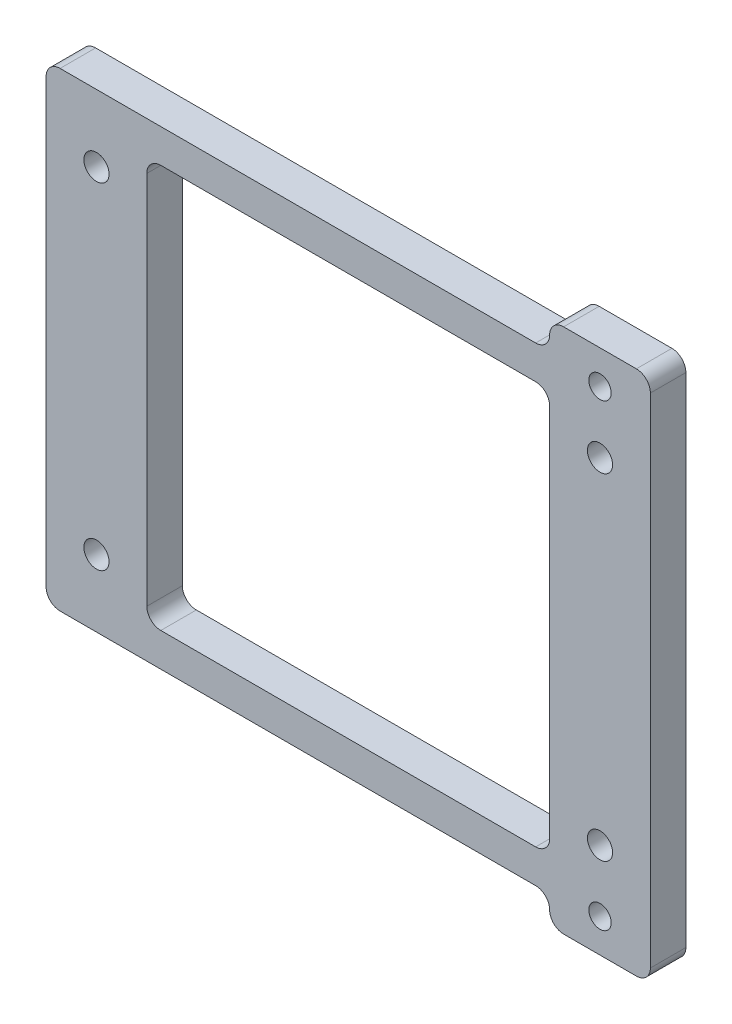
ISO-10303-21;
HEADER;
FILE_DESCRIPTION(('STEP AP214'),'2;1');
FILE_NAME('part.step','',(''),(''),'','','');
FILE_SCHEMA(('AUTOMOTIVE_DESIGN { 1 0 10303 214 1 1 1 1 }'));
ENDSEC;
DATA;
#1=APPLICATION_CONTEXT('core data for automotive mechanical design processes');
#2=APPLICATION_PROTOCOL_DEFINITION('international standard','automotive_design',2000,#1);
#3=PRODUCT_CONTEXT('',#1,'mechanical');
#4=PRODUCT('Part','Part','',(#3));
#5=PRODUCT_RELATED_PRODUCT_CATEGORY('part','',(#4));
#6=PRODUCT_DEFINITION_FORMATION('','',#4);
#7=PRODUCT_DEFINITION_CONTEXT('part definition',#1,'design');
#8=PRODUCT_DEFINITION('design','',#6,#7);
#9=PRODUCT_DEFINITION_SHAPE('','',#8);
#10=(LENGTH_UNIT() NAMED_UNIT(*) SI_UNIT(.MILLI.,.METRE.));
#11=(NAMED_UNIT(*) PLANE_ANGLE_UNIT() SI_UNIT($,.RADIAN.));
#12=(NAMED_UNIT(*) SI_UNIT($,.STERADIAN.) SOLID_ANGLE_UNIT());
#13=UNCERTAINTY_MEASURE_WITH_UNIT(LENGTH_MEASURE(1.E-05),#10,'distance_accuracy_value','');
#14=(GEOMETRIC_REPRESENTATION_CONTEXT(3) GLOBAL_UNCERTAINTY_ASSIGNED_CONTEXT((#13)) GLOBAL_UNIT_ASSIGNED_CONTEXT((#10,
#11,#12)) REPRESENTATION_CONTEXT('',''));
#15=CARTESIAN_POINT('',(0.,0.,0.));
#16=DIRECTION('',(0.,0.,1.));
#17=DIRECTION('',(1.,0.,0.));
#18=AXIS2_PLACEMENT_3D('',#15,#16,#17);
#19=CARTESIAN_POINT('',(0.,0.,6.35));
#20=DIRECTION('',(0.,0.,1.));
#21=DIRECTION('',(1.,0.,0.));
#22=AXIS2_PLACEMENT_3D('',#19,#20,#21);
#23=PLANE('',#22);
#24=CARTESIAN_POINT('',(45.1075947427526,-41.,6.35));
#25=DIRECTION('',(0.,0.,1.));
#26=DIRECTION('',(1.,0.,0.));
#27=AXIS2_PLACEMENT_3D('',#24,#25,#26);
#28=CIRCLE('',#27,2.);
#29=CARTESIAN_POINT('',(47.1075947427526,-41.,6.35));
#30=VERTEX_POINT('',#29);
#31=EDGE_CURVE('E477',#30,#30,#28,.T.);
#32=ORIENTED_EDGE('',*,*,#31,.F.);
#33=EDGE_LOOP('',(#32));
#34=FACE_BOUND('',#33,.T.);
#35=CARTESIAN_POINT('',(45.1075947427528,-30.,6.35));
#36=DIRECTION('',(0.,0.,1.));
#37=DIRECTION('',(1.,0.,0.));
#38=AXIS2_PLACEMENT_3D('',#35,#36,#37);
#39=CIRCLE('',#38,2.25);
#40=CARTESIAN_POINT('',(47.3575947427528,-30.,6.35));
#41=VERTEX_POINT('',#40);
#42=EDGE_CURVE('E505',#41,#41,#39,.T.);
#43=ORIENTED_EDGE('',*,*,#42,.F.);
#44=EDGE_LOOP('',(#43));
#45=FACE_BOUND('',#44,.T.);
#46=CARTESIAN_POINT('',(-44.8924052572479,30.,6.35));
#47=DIRECTION('',(0.,0.,1.));
#48=DIRECTION('',(1.,0.,0.));
#49=AXIS2_PLACEMENT_3D('',#46,#47,#48);
#50=CIRCLE('',#49,2.25);
#51=CARTESIAN_POINT('',(-42.6424052572479,30.,6.35));
#52=VERTEX_POINT('',#51);
#53=EDGE_CURVE('E346',#52,#52,#50,.T.);
#54=ORIENTED_EDGE('',*,*,#53,.F.);
#55=EDGE_LOOP('',(#54));
#56=FACE_BOUND('',#55,.T.);
#57=DIRECTION('',(-1.,0.,0.));
#58=VECTOR('',#57,1.);
#59=CARTESIAN_POINT('',(54.1075947427521,46.9999999999989,6.35));
#60=LINE('',#59,#58);
#61=CARTESIAN_POINT('',(51.6075947427521,46.9999999999989,6.35));
#62=VERTEX_POINT('',#61);
#63=CARTESIAN_POINT('',(38.6075947427521,46.9999999999989,6.35));
#64=VERTEX_POINT('',#63);
#65=EDGE_CURVE('E222',#62,#64,#60,.T.);
#66=ORIENTED_EDGE('',*,*,#65,.T.);
#67=CARTESIAN_POINT('',(38.6075947427521,44.4999999999989,6.35));
#68=DIRECTION('',(0.,0.,1.));
#69=DIRECTION('',(1.,0.,0.));
#70=AXIS2_PLACEMENT_3D('',#67,#68,#69);
#71=CIRCLE('',#70,2.5);
#72=CARTESIAN_POINT('',(36.1075947427521,44.4999999999989,6.35));
#73=VERTEX_POINT('',#72);
#74=EDGE_CURVE('E54',#64,#73,#71,.T.);
#75=ORIENTED_EDGE('',*,*,#74,.T.);
#76=CARTESIAN_POINT('',(33.6075947427521,44.5,6.35));
#77=DIRECTION('',(0.,0.,1.));
#78=DIRECTION('',(1.,0.,0.));
#79=AXIS2_PLACEMENT_3D('',#76,#77,#78);
#80=CIRCLE('',#79,2.5);
#81=CARTESIAN_POINT('',(33.6075947427521,42.,6.35));
#82=VERTEX_POINT('',#81);
#83=EDGE_CURVE('E307',#73,#82,#80,.F.);
#84=ORIENTED_EDGE('',*,*,#83,.T.);
#85=DIRECTION('',(-1.,0.,0.));
#86=VECTOR('',#85,1.);
#87=CARTESIAN_POINT('',(36.1075947427521,42.,6.35));
#88=LINE('',#87,#86);
#89=CARTESIAN_POINT('',(-51.3924052572478,42.,6.35));
#90=VERTEX_POINT('',#89);
#91=EDGE_CURVE('E217',#82,#90,#88,.T.);
#92=ORIENTED_EDGE('',*,*,#91,.T.);
#93=CARTESIAN_POINT('',(-51.3924052572478,39.5,6.35));
#94=DIRECTION('',(0.,0.,1.));
#95=DIRECTION('',(1.,0.,0.));
#96=AXIS2_PLACEMENT_3D('',#93,#94,#95);
#97=CIRCLE('',#96,2.5);
#98=CARTESIAN_POINT('',(-53.8924052572478,39.5,6.35));
#99=VERTEX_POINT('',#98);
#100=EDGE_CURVE('E263',#90,#99,#97,.T.);
#101=ORIENTED_EDGE('',*,*,#100,.T.);
#102=DIRECTION('',(0.,-1.,0.));
#103=VECTOR('',#102,1.);
#104=CARTESIAN_POINT('',(-53.8924052572478,-42.,6.35));
#105=LINE('',#104,#103);
#106=CARTESIAN_POINT('',(-53.8924052572478,-39.5,6.35));
#107=VERTEX_POINT('',#106);
#108=EDGE_CURVE('E355',#99,#107,#105,.T.);
#109=ORIENTED_EDGE('',*,*,#108,.T.);
#110=CARTESIAN_POINT('',(-51.3924052572479,-39.5,6.35));
#111=DIRECTION('',(0.,0.,1.));
#112=DIRECTION('',(1.,0.,0.));
#113=AXIS2_PLACEMENT_3D('',#110,#111,#112);
#114=CIRCLE('',#113,2.5);
#115=CARTESIAN_POINT('',(-51.3924052572478,-42.,6.35));
#116=VERTEX_POINT('',#115);
#117=EDGE_CURVE('E265',#107,#116,#114,.T.);
#118=ORIENTED_EDGE('',*,*,#117,.T.);
#119=DIRECTION('',(1.,0.,0.));
#120=VECTOR('',#119,1.);
#121=CARTESIAN_POINT('',(36.1075947427521,-42.,6.35));
#122=LINE('',#121,#120);
#123=CARTESIAN_POINT('',(33.6075947427521,-42.,6.35));
#124=VERTEX_POINT('',#123);
#125=EDGE_CURVE('E359',#116,#124,#122,.T.);
#126=ORIENTED_EDGE('',*,*,#125,.T.);
#127=CARTESIAN_POINT('',(33.6075947427521,-44.5,6.35));
#128=DIRECTION('',(0.,0.,1.));
#129=DIRECTION('',(1.,0.,0.));
#130=AXIS2_PLACEMENT_3D('',#127,#128,#129);
#131=CIRCLE('',#130,2.5);
#132=CARTESIAN_POINT('',(36.1075947427521,-44.4999999999995,6.35));
#133=VERTEX_POINT('',#132);
#134=EDGE_CURVE('E11',#124,#133,#131,.F.);
#135=ORIENTED_EDGE('',*,*,#134,.T.);
#136=CARTESIAN_POINT('',(38.6075947427521,-44.4999999999995,6.35));
#137=DIRECTION('',(0.,0.,1.));
#138=DIRECTION('',(1.,0.,0.));
#139=AXIS2_PLACEMENT_3D('',#136,#137,#138);
#140=CIRCLE('',#139,2.5);
#141=CARTESIAN_POINT('',(38.6075947427521,-46.9999999999995,6.35));
#142=VERTEX_POINT('',#141);
#143=EDGE_CURVE('E267',#133,#142,#140,.T.);
#144=ORIENTED_EDGE('',*,*,#143,.T.);
#145=DIRECTION('',(1.,0.,0.));
#146=VECTOR('',#145,1.);
#147=CARTESIAN_POINT('',(54.1075947427521,-46.9999999999995,6.35));
#148=LINE('',#147,#146);
#149=CARTESIAN_POINT('',(51.6075947427524,-46.9999999999995,6.35));
#150=VERTEX_POINT('',#149);
#151=EDGE_CURVE('E363',#142,#150,#148,.T.);
#152=ORIENTED_EDGE('',*,*,#151,.T.);
#153=CARTESIAN_POINT('',(51.6075947427524,-44.4999999999995,6.35));
#154=DIRECTION('',(0.,0.,1.));
#155=DIRECTION('',(1.,0.,0.));
#156=AXIS2_PLACEMENT_3D('',#153,#154,#155);
#157=CIRCLE('',#156,2.5);
#158=CARTESIAN_POINT('',(54.1075947427521,-44.4999999999995,6.35));
#159=VERTEX_POINT('',#158);
#160=EDGE_CURVE('E269',#150,#159,#157,.T.);
#161=ORIENTED_EDGE('',*,*,#160,.T.);
#162=DIRECTION('',(0.,1.,0.));
#163=VECTOR('',#162,1.);
#164=CARTESIAN_POINT('',(54.1075947427522,-42.,6.35));
#165=LINE('',#164,#163);
#166=CARTESIAN_POINT('',(54.1075947427524,44.4999999999989,6.35));
#167=VERTEX_POINT('',#166);
#168=EDGE_CURVE('E371',#159,#167,#165,.T.);
#169=ORIENTED_EDGE('',*,*,#168,.T.);
#170=CARTESIAN_POINT('',(51.6075947427521,44.4999999999989,6.35));
#171=DIRECTION('',(0.,0.,1.));
#172=DIRECTION('',(1.,0.,0.));
#173=AXIS2_PLACEMENT_3D('',#170,#171,#172);
#174=CIRCLE('',#173,2.5);
#175=EDGE_CURVE('E271',#167,#62,#174,.T.);
#176=ORIENTED_EDGE('',*,*,#175,.T.);
#177=EDGE_LOOP('',(#66,#75,#84,#92,#101,#109,#118,#126,#135,#144,#152,#161,#169,#176));
#178=FACE_BOUND('',#177,.T.);
#179=CARTESIAN_POINT('',(45.1075947427521,30.,6.35));
#180=DIRECTION('',(0.,0.,1.));
#181=DIRECTION('',(1.,0.,0.));
#182=AXIS2_PLACEMENT_3D('',#179,#180,#181);
#183=CIRCLE('',#182,2.25);
#184=CARTESIAN_POINT('',(47.3575947427521,30.,6.35));
#185=VERTEX_POINT('',#184);
#186=EDGE_CURVE('E511',#185,#185,#183,.T.);
#187=ORIENTED_EDGE('',*,*,#186,.F.);
#188=EDGE_LOOP('',(#187));
#189=FACE_BOUND('',#188,.T.);
#190=CARTESIAN_POINT('',(-44.8924052572472,-30.,6.35));
#191=DIRECTION('',(0.,0.,1.));
#192=DIRECTION('',(1.,0.,0.));
#193=AXIS2_PLACEMENT_3D('',#190,#191,#192);
#194=CIRCLE('',#193,2.25);
#195=CARTESIAN_POINT('',(-42.6424052572472,-30.,6.35));
#196=VERTEX_POINT('',#195);
#197=EDGE_CURVE('E499',#196,#196,#194,.T.);
#198=ORIENTED_EDGE('',*,*,#197,.F.);
#199=EDGE_LOOP('',(#198));
#200=FACE_BOUND('',#199,.T.);
#201=DIRECTION('',(1.,0.,0.));
#202=VECTOR('',#201,1.);
#203=CARTESIAN_POINT('',(36.1075947427521,-36.,6.35));
#204=LINE('',#203,#202);
#205=CARTESIAN_POINT('',(-33.3924052572478,-36.,6.35));
#206=VERTEX_POINT('',#205);
#207=CARTESIAN_POINT('',(33.6075947427521,-36.,6.35));
#208=VERTEX_POINT('',#207);
#209=EDGE_CURVE('E485',#206,#208,#204,.T.);
#210=ORIENTED_EDGE('',*,*,#209,.F.);
#211=CARTESIAN_POINT('',(-33.3924052572478,-33.5,6.35));
#212=DIRECTION('',(0.,0.,1.));
#213=DIRECTION('',(1.,0.,0.));
#214=AXIS2_PLACEMENT_3D('',#211,#212,#213);
#215=CIRCLE('',#214,2.5);
#216=CARTESIAN_POINT('',(-35.8924052572479,-33.5,6.35));
#217=VERTEX_POINT('',#216);
#218=EDGE_CURVE('E202',#206,#217,#215,.F.);
#219=ORIENTED_EDGE('',*,*,#218,.T.);
#220=DIRECTION('',(0.,-1.,0.));
#221=VECTOR('',#220,1.);
#222=CARTESIAN_POINT('',(-35.8924052572479,-36.,6.35));
#223=LINE('',#222,#221);
#224=CARTESIAN_POINT('',(-35.8924052572479,33.5,6.35));
#225=VERTEX_POINT('',#224);
#226=EDGE_CURVE('E482',#225,#217,#223,.T.);
#227=ORIENTED_EDGE('',*,*,#226,.F.);
#228=CARTESIAN_POINT('',(-33.3924052572478,33.5,6.35));
#229=DIRECTION('',(0.,0.,1.));
#230=DIRECTION('',(1.,0.,0.));
#231=AXIS2_PLACEMENT_3D('',#228,#229,#230);
#232=CIRCLE('',#231,2.5);
#233=CARTESIAN_POINT('',(-33.3924052572478,36.,6.35));
#234=VERTEX_POINT('',#233);
#235=EDGE_CURVE('E299',#225,#234,#232,.F.);
#236=ORIENTED_EDGE('',*,*,#235,.T.);
#237=DIRECTION('',(-1.,0.,0.));
#238=VECTOR('',#237,1.);
#239=CARTESIAN_POINT('',(36.1075947427521,36.,6.35));
#240=LINE('',#239,#238);
#241=CARTESIAN_POINT('',(33.6075947427521,36.,6.35));
#242=VERTEX_POINT('',#241);
#243=EDGE_CURVE('E491',#242,#234,#240,.T.);
#244=ORIENTED_EDGE('',*,*,#243,.F.);
#245=CARTESIAN_POINT('',(33.6075947427521,33.5,6.35));
#246=DIRECTION('',(0.,0.,1.));
#247=DIRECTION('',(1.,0.,0.));
#248=AXIS2_PLACEMENT_3D('',#245,#246,#247);
#249=CIRCLE('',#248,2.5);
#250=CARTESIAN_POINT('',(36.1075947427521,33.5,6.35));
#251=VERTEX_POINT('',#250);
#252=EDGE_CURVE('E303',#242,#251,#249,.F.);
#253=ORIENTED_EDGE('',*,*,#252,.T.);
#254=DIRECTION('',(0.,1.,0.));
#255=VECTOR('',#254,1.);
#256=CARTESIAN_POINT('',(36.1075947427521,-36.,6.35));
#257=LINE('',#256,#255);
#258=CARTESIAN_POINT('',(36.1075947427521,-33.5,6.35));
#259=VERTEX_POINT('',#258);
#260=EDGE_CURVE('E488',#259,#251,#257,.T.);
#261=ORIENTED_EDGE('',*,*,#260,.F.);
#262=CARTESIAN_POINT('',(33.6075947427521,-33.5,6.35));
#263=DIRECTION('',(0.,0.,1.));
#264=DIRECTION('',(1.,0.,0.));
#265=AXIS2_PLACEMENT_3D('',#262,#263,#264);
#266=CIRCLE('',#265,2.5);
#267=EDGE_CURVE('E203',#259,#208,#266,.F.);
#268=ORIENTED_EDGE('',*,*,#267,.T.);
#269=EDGE_LOOP('',(#210,#219,#227,#236,#244,#253,#261,#268));
#270=FACE_BOUND('',#269,.T.);
#271=CARTESIAN_POINT('',(45.1075947427526,41.,6.35));
#272=DIRECTION('',(0.,0.,1.));
#273=DIRECTION('',(-1.,0.,0.));
#274=AXIS2_PLACEMENT_3D('',#271,#272,#273);
#275=CIRCLE('',#274,2.);
#276=CARTESIAN_POINT('',(43.1075947427526,41.,6.35));
#277=VERTEX_POINT('',#276);
#278=EDGE_CURVE('E315',#277,#277,#275,.T.);
#279=ORIENTED_EDGE('',*,*,#278,.F.);
#280=EDGE_LOOP('',(#279));
#281=FACE_BOUND('',#280,.T.);
#282=ADVANCED_FACE('F37',(#34,#45,#56,#178,#189,#200,#270,#281),#23,.T.);
#283=CARTESIAN_POINT('',(0.,0.,0.));
#284=DIRECTION('',(0.,0.,1.));
#285=DIRECTION('',(1.,0.,0.));
#286=AXIS2_PLACEMENT_3D('',#283,#284,#285);
#287=PLANE('',#286);
#288=CARTESIAN_POINT('',(-44.8924052572472,-30.,0.));
#289=DIRECTION('',(0.,0.,1.));
#290=DIRECTION('',(1.,0.,0.));
#291=AXIS2_PLACEMENT_3D('',#288,#289,#290);
#292=CIRCLE('',#291,2.25);
#293=CARTESIAN_POINT('',(-42.6424052572472,-30.,0.));
#294=VERTEX_POINT('',#293);
#295=EDGE_CURVE('E494',#294,#294,#292,.T.);
#296=ORIENTED_EDGE('',*,*,#295,.T.);
#297=EDGE_LOOP('',(#296));
#298=FACE_BOUND('',#297,.T.);
#299=CARTESIAN_POINT('',(45.1075947427528,-30.,0.));
#300=DIRECTION('',(0.,0.,1.));
#301=DIRECTION('',(1.,0.,0.));
#302=AXIS2_PLACEMENT_3D('',#299,#300,#301);
#303=CIRCLE('',#302,2.25);
#304=CARTESIAN_POINT('',(47.3575947427528,-30.,0.));
#305=VERTEX_POINT('',#304);
#306=EDGE_CURVE('E502',#305,#305,#303,.T.);
#307=ORIENTED_EDGE('',*,*,#306,.T.);
#308=EDGE_LOOP('',(#307));
#309=FACE_BOUND('',#308,.T.);
#310=CARTESIAN_POINT('',(45.1075947427521,30.,0.));
#311=DIRECTION('',(0.,0.,1.));
#312=DIRECTION('',(1.,0.,0.));
#313=AXIS2_PLACEMENT_3D('',#310,#311,#312);
#314=CIRCLE('',#313,2.25);
#315=CARTESIAN_POINT('',(47.3575947427521,30.,0.));
#316=VERTEX_POINT('',#315);
#317=EDGE_CURVE('E508',#316,#316,#314,.T.);
#318=ORIENTED_EDGE('',*,*,#317,.T.);
#319=EDGE_LOOP('',(#318));
#320=FACE_BOUND('',#319,.T.);
#321=CARTESIAN_POINT('',(-44.8924052572479,30.,0.));
#322=DIRECTION('',(0.,0.,1.));
#323=DIRECTION('',(1.,0.,0.));
#324=AXIS2_PLACEMENT_3D('',#321,#322,#323);
#325=CIRCLE('',#324,2.25);
#326=CARTESIAN_POINT('',(-42.6424052572479,30.,0.));
#327=VERTEX_POINT('',#326);
#328=EDGE_CURVE('E366',#327,#327,#325,.T.);
#329=ORIENTED_EDGE('',*,*,#328,.T.);
#330=EDGE_LOOP('',(#329));
#331=FACE_BOUND('',#330,.T.);
#332=DIRECTION('',(-1.,0.,0.));
#333=VECTOR('',#332,1.);
#334=CARTESIAN_POINT('',(36.1075947427521,42.,0.));
#335=LINE('',#334,#333);
#336=CARTESIAN_POINT('',(33.6075947427521,42.,0.));
#337=VERTEX_POINT('',#336);
#338=CARTESIAN_POINT('',(-51.3924052572478,42.,0.));
#339=VERTEX_POINT('',#338);
#340=EDGE_CURVE('E225',#337,#339,#335,.T.);
#341=ORIENTED_EDGE('',*,*,#340,.F.);
#342=CARTESIAN_POINT('',(33.6075947427521,44.5,0.));
#343=DIRECTION('',(0.,0.,1.));
#344=DIRECTION('',(1.,0.,0.));
#345=AXIS2_PLACEMENT_3D('',#342,#343,#344);
#346=CIRCLE('',#345,2.5);
#347=CARTESIAN_POINT('',(36.1075947427521,44.4999999999989,0.));
#348=VERTEX_POINT('',#347);
#349=EDGE_CURVE('E305',#337,#348,#346,.T.);
#350=ORIENTED_EDGE('',*,*,#349,.T.);
#351=CARTESIAN_POINT('',(38.6075947427521,44.4999999999989,0.));
#352=DIRECTION('',(0.,0.,1.));
#353=DIRECTION('',(1.,0.,0.));
#354=AXIS2_PLACEMENT_3D('',#351,#352,#353);
#355=CIRCLE('',#354,2.5);
#356=CARTESIAN_POINT('',(38.6075947427521,46.9999999999989,0.));
#357=VERTEX_POINT('',#356);
#358=EDGE_CURVE('E256',#348,#357,#355,.F.);
#359=ORIENTED_EDGE('',*,*,#358,.T.);
#360=DIRECTION('',(-1.,0.,0.));
#361=VECTOR('',#360,1.);
#362=CARTESIAN_POINT('',(54.1075947427521,46.9999999999989,0.));
#363=LINE('',#362,#361);
#364=CARTESIAN_POINT('',(51.6075947427521,46.9999999999989,0.));
#365=VERTEX_POINT('',#364);
#366=EDGE_CURVE('E349',#365,#357,#363,.T.);
#367=ORIENTED_EDGE('',*,*,#366,.F.);
#368=CARTESIAN_POINT('',(51.6075947427521,44.4999999999989,0.));
#369=DIRECTION('',(0.,0.,1.));
#370=DIRECTION('',(1.,0.,0.));
#371=AXIS2_PLACEMENT_3D('',#368,#369,#370);
#372=CIRCLE('',#371,2.5);
#373=CARTESIAN_POINT('',(54.1075947427521,44.4999999999989,0.));
#374=VERTEX_POINT('',#373);
#375=EDGE_CURVE('E254',#365,#374,#372,.F.);
#376=ORIENTED_EDGE('',*,*,#375,.T.);
#377=DIRECTION('',(0.,1.,0.));
#378=VECTOR('',#377,1.);
#379=CARTESIAN_POINT('',(54.1075947427522,42.,0.));
#380=LINE('',#379,#378);
#381=CARTESIAN_POINT('',(54.1075947427524,-44.4999999999995,0.));
#382=VERTEX_POINT('',#381);
#383=EDGE_CURVE('E343',#382,#374,#380,.T.);
#384=ORIENTED_EDGE('',*,*,#383,.F.);
#385=CARTESIAN_POINT('',(51.6075947427524,-44.4999999999995,0.));
#386=DIRECTION('',(0.,0.,1.));
#387=DIRECTION('',(1.,0.,0.));
#388=AXIS2_PLACEMENT_3D('',#385,#386,#387);
#389=CIRCLE('',#388,2.5);
#390=CARTESIAN_POINT('',(51.6075947427524,-46.9999999999995,0.));
#391=VERTEX_POINT('',#390);
#392=EDGE_CURVE('E252',#382,#391,#389,.F.);
#393=ORIENTED_EDGE('',*,*,#392,.T.);
#394=DIRECTION('',(1.,0.,0.));
#395=VECTOR('',#394,1.);
#396=CARTESIAN_POINT('',(54.1075947427521,-46.9999999999995,0.));
#397=LINE('',#396,#395);
#398=CARTESIAN_POINT('',(38.6075947427521,-46.9999999999995,0.));
#399=VERTEX_POINT('',#398);
#400=EDGE_CURVE('E339',#399,#391,#397,.T.);
#401=ORIENTED_EDGE('',*,*,#400,.F.);
#402=CARTESIAN_POINT('',(38.6075947427521,-44.4999999999995,0.));
#403=DIRECTION('',(0.,0.,1.));
#404=DIRECTION('',(1.,0.,0.));
#405=AXIS2_PLACEMENT_3D('',#402,#403,#404);
#406=CIRCLE('',#405,2.5);
#407=CARTESIAN_POINT('',(36.1075947427521,-44.4999999999995,0.));
#408=VERTEX_POINT('',#407);
#409=EDGE_CURVE('E250',#399,#408,#406,.F.);
#410=ORIENTED_EDGE('',*,*,#409,.T.);
#411=CARTESIAN_POINT('',(33.6075947427521,-44.5,0.));
#412=DIRECTION('',(0.,0.,1.));
#413=DIRECTION('',(1.,0.,0.));
#414=AXIS2_PLACEMENT_3D('',#411,#412,#413);
#415=CIRCLE('',#414,2.5);
#416=CARTESIAN_POINT('',(33.6075947427521,-42.,0.));
#417=VERTEX_POINT('',#416);
#418=EDGE_CURVE('E46',#408,#417,#415,.T.);
#419=ORIENTED_EDGE('',*,*,#418,.T.);
#420=DIRECTION('',(1.,0.,0.));
#421=VECTOR('',#420,1.);
#422=CARTESIAN_POINT('',(36.1075947427521,-42.,0.));
#423=LINE('',#422,#421);
#424=CARTESIAN_POINT('',(-51.3924052572478,-42.,0.));
#425=VERTEX_POINT('',#424);
#426=EDGE_CURVE('E332',#425,#417,#423,.T.);
#427=ORIENTED_EDGE('',*,*,#426,.F.);
#428=CARTESIAN_POINT('',(-51.3924052572479,-39.5,0.));
#429=DIRECTION('',(0.,0.,1.));
#430=DIRECTION('',(1.,0.,0.));
#431=AXIS2_PLACEMENT_3D('',#428,#429,#430);
#432=CIRCLE('',#431,2.5);
#433=CARTESIAN_POINT('',(-53.8924052572478,-39.5,0.));
#434=VERTEX_POINT('',#433);
#435=EDGE_CURVE('E248',#425,#434,#432,.F.);
#436=ORIENTED_EDGE('',*,*,#435,.T.);
#437=DIRECTION('',(0.,-1.,0.));
#438=VECTOR('',#437,1.);
#439=CARTESIAN_POINT('',(-53.8924052572478,-42.,0.));
#440=LINE('',#439,#438);
#441=CARTESIAN_POINT('',(-53.8924052572478,39.5,0.));
#442=VERTEX_POINT('',#441);
#443=EDGE_CURVE('E340',#442,#434,#440,.T.);
#444=ORIENTED_EDGE('',*,*,#443,.F.);
#445=CARTESIAN_POINT('',(-51.3924052572478,39.5,0.));
#446=DIRECTION('',(0.,0.,1.));
#447=DIRECTION('',(1.,0.,0.));
#448=AXIS2_PLACEMENT_3D('',#445,#446,#447);
#449=CIRCLE('',#448,2.5);
#450=EDGE_CURVE('E246',#442,#339,#449,.F.);
#451=ORIENTED_EDGE('',*,*,#450,.T.);
#452=EDGE_LOOP('',(#341,#350,#359,#367,#376,#384,#393,#401,#410,#419,#427,#436,#444,#451));
#453=FACE_BOUND('',#452,.T.);
#454=DIRECTION('',(-1.,0.,0.));
#455=VECTOR('',#454,1.);
#456=CARTESIAN_POINT('',(36.1075947427521,36.,0.));
#457=LINE('',#456,#455);
#458=CARTESIAN_POINT('',(33.6075947427521,36.,0.));
#459=VERTEX_POINT('',#458);
#460=CARTESIAN_POINT('',(-33.3924052572478,36.,0.));
#461=VERTEX_POINT('',#460);
#462=EDGE_CURVE('E486',#459,#461,#457,.T.);
#463=ORIENTED_EDGE('',*,*,#462,.T.);
#464=CARTESIAN_POINT('',(-33.3924052572478,33.5,0.));
#465=DIRECTION('',(0.,0.,1.));
#466=DIRECTION('',(1.,0.,0.));
#467=AXIS2_PLACEMENT_3D('',#464,#465,#466);
#468=CIRCLE('',#467,2.5);
#469=CARTESIAN_POINT('',(-35.8924052572479,33.5,0.));
#470=VERTEX_POINT('',#469);
#471=EDGE_CURVE('E297',#461,#470,#468,.T.);
#472=ORIENTED_EDGE('',*,*,#471,.T.);
#473=DIRECTION('',(0.,-1.,0.));
#474=VECTOR('',#473,1.);
#475=CARTESIAN_POINT('',(-35.8924052572479,-36.,0.));
#476=LINE('',#475,#474);
#477=CARTESIAN_POINT('',(-35.8924052572479,-33.5,0.));
#478=VERTEX_POINT('',#477);
#479=EDGE_CURVE('E197',#470,#478,#476,.T.);
#480=ORIENTED_EDGE('',*,*,#479,.T.);
#481=CARTESIAN_POINT('',(-33.3924052572478,-33.5,0.));
#482=DIRECTION('',(0.,0.,1.));
#483=DIRECTION('',(1.,0.,0.));
#484=AXIS2_PLACEMENT_3D('',#481,#482,#483);
#485=CIRCLE('',#484,2.5);
#486=CARTESIAN_POINT('',(-33.3924052572478,-36.,0.));
#487=VERTEX_POINT('',#486);
#488=EDGE_CURVE('E190',#478,#487,#485,.T.);
#489=ORIENTED_EDGE('',*,*,#488,.T.);
#490=DIRECTION('',(1.,0.,0.));
#491=VECTOR('',#490,1.);
#492=CARTESIAN_POINT('',(36.1075947427521,-36.,0.));
#493=LINE('',#492,#491);
#494=CARTESIAN_POINT('',(33.6075947427521,-36.,0.));
#495=VERTEX_POINT('',#494);
#496=EDGE_CURVE('E195',#487,#495,#493,.T.);
#497=ORIENTED_EDGE('',*,*,#496,.T.);
#498=CARTESIAN_POINT('',(33.6075947427521,-33.5,0.));
#499=DIRECTION('',(0.,0.,1.));
#500=DIRECTION('',(1.,0.,0.));
#501=AXIS2_PLACEMENT_3D('',#498,#499,#500);
#502=CIRCLE('',#501,2.5);
#503=CARTESIAN_POINT('',(36.1075947427521,-33.5,0.));
#504=VERTEX_POINT('',#503);
#505=EDGE_CURVE('E293',#495,#504,#502,.T.);
#506=ORIENTED_EDGE('',*,*,#505,.T.);
#507=DIRECTION('',(0.,1.,0.));
#508=VECTOR('',#507,1.);
#509=CARTESIAN_POINT('',(36.1075947427521,-36.,0.));
#510=LINE('',#509,#508);
#511=CARTESIAN_POINT('',(36.1075947427521,33.5,0.));
#512=VERTEX_POINT('',#511);
#513=EDGE_CURVE('E213',#504,#512,#510,.T.);
#514=ORIENTED_EDGE('',*,*,#513,.T.);
#515=CARTESIAN_POINT('',(33.6075947427521,33.5,0.));
#516=DIRECTION('',(0.,0.,1.));
#517=DIRECTION('',(1.,0.,0.));
#518=AXIS2_PLACEMENT_3D('',#515,#516,#517);
#519=CIRCLE('',#518,2.5);
#520=EDGE_CURVE('E301',#512,#459,#519,.T.);
#521=ORIENTED_EDGE('',*,*,#520,.T.);
#522=EDGE_LOOP('',(#463,#472,#480,#489,#497,#506,#514,#521));
#523=FACE_BOUND('',#522,.T.);
#524=CARTESIAN_POINT('',(45.1075947427526,-41.,0.));
#525=DIRECTION('',(0.,0.,1.));
#526=DIRECTION('',(1.,0.,0.));
#527=AXIS2_PLACEMENT_3D('',#524,#525,#526);
#528=CIRCLE('',#527,2.);
#529=CARTESIAN_POINT('',(47.1075947427526,-41.,0.));
#530=VERTEX_POINT('',#529);
#531=EDGE_CURVE('E474',#530,#530,#528,.T.);
#532=ORIENTED_EDGE('',*,*,#531,.T.);
#533=EDGE_LOOP('',(#532));
#534=FACE_BOUND('',#533,.T.);
#535=CARTESIAN_POINT('',(45.1075947427526,41.,0.));
#536=DIRECTION('',(0.,0.,1.));
#537=DIRECTION('',(-1.,0.,0.));
#538=AXIS2_PLACEMENT_3D('',#535,#536,#537);
#539=CIRCLE('',#538,2.);
#540=CARTESIAN_POINT('',(43.1075947427526,41.,0.));
#541=VERTEX_POINT('',#540);
#542=EDGE_CURVE('E311',#541,#541,#539,.T.);
#543=ORIENTED_EDGE('',*,*,#542,.T.);
#544=EDGE_LOOP('',(#543));
#545=FACE_BOUND('',#544,.T.);
#546=ADVANCED_FACE('F193',(#298,#309,#320,#331,#453,#523,#534,#545),#287,.F.);
#547=CARTESIAN_POINT('',(-53.8924052572478,-42.,6.35));
#548=DIRECTION('',(1.,0.,0.));
#549=DIRECTION('',(0.,0.,-1.));
#550=AXIS2_PLACEMENT_3D('',#547,#548,#549);
#551=PLANE('',#550);
#552=ORIENTED_EDGE('',*,*,#443,.T.);
#553=DIRECTION('',(0.,0.,-1.));
#554=VECTOR('',#553,1.);
#555=CARTESIAN_POINT('',(-53.8924052572478,-39.5,6.35));
#556=LINE('',#555,#554);
#557=EDGE_CURVE('E291',#434,#107,#556,.F.);
#558=ORIENTED_EDGE('',*,*,#557,.T.);
#559=ORIENTED_EDGE('',*,*,#108,.F.);
#560=DIRECTION('',(0.,0.,-1.));
#561=VECTOR('',#560,1.);
#562=CARTESIAN_POINT('',(-53.8924052572478,39.5,6.35));
#563=LINE('',#562,#561);
#564=EDGE_CURVE('E288',#99,#442,#563,.T.);
#565=ORIENTED_EDGE('',*,*,#564,.T.);
#566=EDGE_LOOP('',(#552,#558,#559,#565));
#567=FACE_BOUND('',#566,.T.);
#568=ADVANCED_FACE('F388',(#567),#551,.F.);
#569=CARTESIAN_POINT('',(36.1075947427521,-42.,6.35));
#570=DIRECTION('',(0.,1.,0.));
#571=DIRECTION('',(0.,0.,1.));
#572=AXIS2_PLACEMENT_3D('',#569,#570,#571);
#573=PLANE('',#572);
#574=ORIENTED_EDGE('',*,*,#125,.F.);
#575=DIRECTION('',(0.,0.,-1.));
#576=VECTOR('',#575,1.);
#577=CARTESIAN_POINT('',(-51.3924052572479,-42.,6.35));
#578=LINE('',#577,#576);
#579=EDGE_CURVE('E285',#116,#425,#578,.T.);
#580=ORIENTED_EDGE('',*,*,#579,.T.);
#581=ORIENTED_EDGE('',*,*,#426,.T.);
#582=DIRECTION('',(0.,0.,-1.));
#583=VECTOR('',#582,1.);
#584=CARTESIAN_POINT('',(33.6075947427521,-42.,6.35));
#585=LINE('',#584,#583);
#586=EDGE_CURVE('E283',#417,#124,#585,.F.);
#587=ORIENTED_EDGE('',*,*,#586,.T.);
#588=EDGE_LOOP('',(#574,#580,#581,#587));
#589=FACE_BOUND('',#588,.T.);
#590=ADVANCED_FACE('F336',(#589),#573,.F.);
#591=CARTESIAN_POINT('',(54.1075947427521,-46.9999999999995,6.35));
#592=DIRECTION('',(0.,1.,0.));
#593=DIRECTION('',(0.,0.,1.));
#594=AXIS2_PLACEMENT_3D('',#591,#592,#593);
#595=PLANE('',#594);
#596=ORIENTED_EDGE('',*,*,#400,.T.);
#597=DIRECTION('',(0.,0.,-1.));
#598=VECTOR('',#597,1.);
#599=CARTESIAN_POINT('',(51.6075947427524,-46.9999999999995,6.35));
#600=LINE('',#599,#598);
#601=EDGE_CURVE('E281',#391,#150,#600,.F.);
#602=ORIENTED_EDGE('',*,*,#601,.T.);
#603=ORIENTED_EDGE('',*,*,#151,.F.);
#604=DIRECTION('',(0.,0.,-1.));
#605=VECTOR('',#604,1.);
#606=CARTESIAN_POINT('',(38.6075947427521,-46.9999999999995,6.35));
#607=LINE('',#606,#605);
#608=EDGE_CURVE('E278',#142,#399,#607,.T.);
#609=ORIENTED_EDGE('',*,*,#608,.T.);
#610=EDGE_LOOP('',(#596,#602,#603,#609));
#611=FACE_BOUND('',#610,.T.);
#612=ADVANCED_FACE('F396',(#611),#595,.F.);
#613=CARTESIAN_POINT('',(54.1075947427522,42.,6.35));
#614=DIRECTION('',(-1.,0.,0.));
#615=DIRECTION('',(0.,-1.,0.));
#616=AXIS2_PLACEMENT_3D('',#613,#614,#615);
#617=PLANE('',#616);
#618=ORIENTED_EDGE('',*,*,#383,.T.);
#619=DIRECTION('',(0.,0.,-1.));
#620=VECTOR('',#619,1.);
#621=CARTESIAN_POINT('',(54.1075947427521,44.4999999999989,6.35));
#622=LINE('',#621,#620);
#623=EDGE_CURVE('E62',#374,#167,#622,.F.);
#624=ORIENTED_EDGE('',*,*,#623,.T.);
#625=ORIENTED_EDGE('',*,*,#168,.F.);
#626=DIRECTION('',(0.,0.,-1.));
#627=VECTOR('',#626,1.);
#628=CARTESIAN_POINT('',(54.1075947427524,-44.4999999999995,6.35));
#629=LINE('',#628,#627);
#630=EDGE_CURVE('E274',#159,#382,#629,.T.);
#631=ORIENTED_EDGE('',*,*,#630,.T.);
#632=EDGE_LOOP('',(#618,#624,#625,#631));
#633=FACE_BOUND('',#632,.T.);
#634=ADVANCED_FACE('F401',(#633),#617,.F.);
#635=CARTESIAN_POINT('',(54.1075947427521,46.9999999999989,6.35));
#636=DIRECTION('',(0.,-1.,0.));
#637=DIRECTION('',(0.,0.,-1.));
#638=AXIS2_PLACEMENT_3D('',#635,#636,#637);
#639=PLANE('',#638);
#640=ORIENTED_EDGE('',*,*,#366,.T.);
#641=DIRECTION('',(0.,0.,-1.));
#642=VECTOR('',#641,1.);
#643=CARTESIAN_POINT('',(38.6075947427521,46.9999999999989,6.35));
#644=LINE('',#643,#642);
#645=EDGE_CURVE('E261',#357,#64,#644,.F.);
#646=ORIENTED_EDGE('',*,*,#645,.T.);
#647=ORIENTED_EDGE('',*,*,#65,.F.);
#648=DIRECTION('',(0.,0.,-1.));
#649=VECTOR('',#648,1.);
#650=CARTESIAN_POINT('',(51.6075947427521,46.9999999999989,6.35));
#651=LINE('',#650,#649);
#652=EDGE_CURVE('E258',#62,#365,#651,.T.);
#653=ORIENTED_EDGE('',*,*,#652,.T.);
#654=EDGE_LOOP('',(#640,#646,#647,#653));
#655=FACE_BOUND('',#654,.T.);
#656=ADVANCED_FACE('F405',(#655),#639,.F.);
#657=CARTESIAN_POINT('',(36.1075947427521,42.,6.35));
#658=DIRECTION('',(0.,-1.,0.));
#659=DIRECTION('',(0.,0.,-1.));
#660=AXIS2_PLACEMENT_3D('',#657,#658,#659);
#661=PLANE('',#660);
#662=ORIENTED_EDGE('',*,*,#91,.F.);
#663=DIRECTION('',(0.,0.,-1.));
#664=VECTOR('',#663,1.);
#665=CARTESIAN_POINT('',(33.6075947427521,42.,0.));
#666=LINE('',#665,#664);
#667=EDGE_CURVE('E243',#82,#337,#666,.T.);
#668=ORIENTED_EDGE('',*,*,#667,.T.);
#669=ORIENTED_EDGE('',*,*,#340,.T.);
#670=DIRECTION('',(0.,0.,-1.));
#671=VECTOR('',#670,1.);
#672=CARTESIAN_POINT('',(-51.3924052572479,42.,6.35));
#673=LINE('',#672,#671);
#674=EDGE_CURVE('E241',#339,#90,#673,.F.);
#675=ORIENTED_EDGE('',*,*,#674,.T.);
#676=EDGE_LOOP('',(#662,#668,#669,#675));
#677=FACE_BOUND('',#676,.T.);
#678=ADVANCED_FACE('F384',(#677),#661,.F.);
#679=CARTESIAN_POINT('',(-44.8924052572479,30.,6.35));
#680=DIRECTION('',(0.,0.,-1.));
#681=DIRECTION('',(-1.,0.,0.));
#682=AXIS2_PLACEMENT_3D('',#679,#680,#681);
#683=CYLINDRICAL_SURFACE('',#682,2.25);
#684=ORIENTED_EDGE('',*,*,#53,.T.);
#685=EDGE_LOOP('',(#684));
#686=FACE_BOUND('',#685,.T.);
#687=ORIENTED_EDGE('',*,*,#328,.F.);
#688=EDGE_LOOP('',(#687));
#689=FACE_BOUND('',#688,.T.);
#690=ADVANCED_FACE('F412',(#686,#689),#683,.F.);
#691=CARTESIAN_POINT('',(45.1075947427521,30.,6.35));
#692=DIRECTION('',(0.,0.,-1.));
#693=DIRECTION('',(-1.,0.,0.));
#694=AXIS2_PLACEMENT_3D('',#691,#692,#693);
#695=CYLINDRICAL_SURFACE('',#694,2.25);
#696=ORIENTED_EDGE('',*,*,#186,.T.);
#697=EDGE_LOOP('',(#696));
#698=FACE_BOUND('',#697,.T.);
#699=ORIENTED_EDGE('',*,*,#317,.F.);
#700=EDGE_LOOP('',(#699));
#701=FACE_BOUND('',#700,.T.);
#702=ADVANCED_FACE('F428',(#698,#701),#695,.F.);
#703=CARTESIAN_POINT('',(45.1075947427528,-30.,6.35));
#704=DIRECTION('',(0.,0.,-1.));
#705=DIRECTION('',(-1.,0.,0.));
#706=AXIS2_PLACEMENT_3D('',#703,#704,#705);
#707=CYLINDRICAL_SURFACE('',#706,2.25);
#708=ORIENTED_EDGE('',*,*,#42,.T.);
#709=EDGE_LOOP('',(#708));
#710=FACE_BOUND('',#709,.T.);
#711=ORIENTED_EDGE('',*,*,#306,.F.);
#712=EDGE_LOOP('',(#711));
#713=FACE_BOUND('',#712,.T.);
#714=ADVANCED_FACE('F432',(#710,#713),#707,.F.);
#715=CARTESIAN_POINT('',(-44.8924052572472,-30.,6.35));
#716=DIRECTION('',(0.,0.,-1.));
#717=DIRECTION('',(-1.,0.,0.));
#718=AXIS2_PLACEMENT_3D('',#715,#716,#717);
#719=CYLINDRICAL_SURFACE('',#718,2.25);
#720=ORIENTED_EDGE('',*,*,#197,.T.);
#721=EDGE_LOOP('',(#720));
#722=FACE_BOUND('',#721,.T.);
#723=ORIENTED_EDGE('',*,*,#295,.F.);
#724=EDGE_LOOP('',(#723));
#725=FACE_BOUND('',#724,.T.);
#726=ADVANCED_FACE('F436',(#722,#725),#719,.F.);
#727=CARTESIAN_POINT('',(-35.8924052572479,-36.,6.35));
#728=DIRECTION('',(1.,0.,0.));
#729=DIRECTION('',(0.,0.,-1.));
#730=AXIS2_PLACEMENT_3D('',#727,#728,#729);
#731=PLANE('',#730);
#732=ORIENTED_EDGE('',*,*,#226,.T.);
#733=DIRECTION('',(0.,0.,-1.));
#734=VECTOR('',#733,1.);
#735=CARTESIAN_POINT('',(-35.8924052572479,-33.5,0.));
#736=LINE('',#735,#734);
#737=EDGE_CURVE('E234',#217,#478,#736,.T.);
#738=ORIENTED_EDGE('',*,*,#737,.T.);
#739=ORIENTED_EDGE('',*,*,#479,.F.);
#740=DIRECTION('',(0.,0.,-1.));
#741=VECTOR('',#740,1.);
#742=CARTESIAN_POINT('',(-35.8924052572479,33.5,6.35));
#743=LINE('',#742,#741);
#744=EDGE_CURVE('E232',#470,#225,#743,.F.);
#745=ORIENTED_EDGE('',*,*,#744,.T.);
#746=EDGE_LOOP('',(#732,#738,#739,#745));
#747=FACE_BOUND('',#746,.T.);
#748=ADVANCED_FACE('F440',(#747),#731,.T.);
#749=CARTESIAN_POINT('',(36.1075947427521,-36.,6.35));
#750=DIRECTION('',(0.,1.,0.));
#751=DIRECTION('',(-1.,0.,0.));
#752=AXIS2_PLACEMENT_3D('',#749,#750,#751);
#753=PLANE('',#752);
#754=ORIENTED_EDGE('',*,*,#209,.T.);
#755=DIRECTION('',(0.,0.,-1.));
#756=VECTOR('',#755,1.);
#757=CARTESIAN_POINT('',(33.6075947427521,-36.,0.));
#758=LINE('',#757,#756);
#759=EDGE_CURVE('E212',#208,#495,#758,.T.);
#760=ORIENTED_EDGE('',*,*,#759,.T.);
#761=ORIENTED_EDGE('',*,*,#496,.F.);
#762=DIRECTION('',(0.,0.,-1.));
#763=VECTOR('',#762,1.);
#764=CARTESIAN_POINT('',(-33.3924052572478,-36.,6.35));
#765=LINE('',#764,#763);
#766=EDGE_CURVE('E209',#487,#206,#765,.F.);
#767=ORIENTED_EDGE('',*,*,#766,.T.);
#768=EDGE_LOOP('',(#754,#760,#761,#767));
#769=FACE_BOUND('',#768,.T.);
#770=ADVANCED_FACE('F208',(#769),#753,.T.);
#771=CARTESIAN_POINT('',(36.1075947427521,-36.,6.35));
#772=DIRECTION('',(-1.,0.,0.));
#773=DIRECTION('',(0.,0.,1.));
#774=AXIS2_PLACEMENT_3D('',#771,#772,#773);
#775=PLANE('',#774);
#776=ORIENTED_EDGE('',*,*,#513,.F.);
#777=DIRECTION('',(0.,0.,-1.));
#778=VECTOR('',#777,1.);
#779=CARTESIAN_POINT('',(36.1075947427521,-33.5,6.35));
#780=LINE('',#779,#778);
#781=EDGE_CURVE('E230',#504,#259,#780,.F.);
#782=ORIENTED_EDGE('',*,*,#781,.T.);
#783=ORIENTED_EDGE('',*,*,#260,.T.);
#784=DIRECTION('',(0.,0.,-1.));
#785=VECTOR('',#784,1.);
#786=CARTESIAN_POINT('',(36.1075947427521,33.5,0.));
#787=LINE('',#786,#785);
#788=EDGE_CURVE('E219',#251,#512,#787,.T.);
#789=ORIENTED_EDGE('',*,*,#788,.T.);
#790=EDGE_LOOP('',(#776,#782,#783,#789));
#791=FACE_BOUND('',#790,.T.);
#792=ADVANCED_FACE('F447',(#791),#775,.T.);
#793=CARTESIAN_POINT('',(36.1075947427521,36.,6.35));
#794=DIRECTION('',(0.,-1.,0.));
#795=DIRECTION('',(1.,0.,0.));
#796=AXIS2_PLACEMENT_3D('',#793,#794,#795);
#797=PLANE('',#796);
#798=ORIENTED_EDGE('',*,*,#243,.T.);
#799=DIRECTION('',(0.,0.,-1.));
#800=VECTOR('',#799,1.);
#801=CARTESIAN_POINT('',(-33.3924052572478,36.,0.));
#802=LINE('',#801,#800);
#803=EDGE_CURVE('E238',#234,#461,#802,.T.);
#804=ORIENTED_EDGE('',*,*,#803,.T.);
#805=ORIENTED_EDGE('',*,*,#462,.F.);
#806=DIRECTION('',(0.,0.,-1.));
#807=VECTOR('',#806,1.);
#808=CARTESIAN_POINT('',(33.6075947427521,36.,6.35));
#809=LINE('',#808,#807);
#810=EDGE_CURVE('E236',#459,#242,#809,.F.);
#811=ORIENTED_EDGE('',*,*,#810,.T.);
#812=EDGE_LOOP('',(#798,#804,#805,#811));
#813=FACE_BOUND('',#812,.T.);
#814=ADVANCED_FACE('F450',(#813),#797,.T.);
#815=CARTESIAN_POINT('',(45.1075947427526,-41.,6.35));
#816=DIRECTION('',(0.,0.,-1.));
#817=DIRECTION('',(-1.,0.,0.));
#818=AXIS2_PLACEMENT_3D('',#815,#816,#817);
#819=CYLINDRICAL_SURFACE('',#818,2.);
#820=ORIENTED_EDGE('',*,*,#31,.T.);
#821=EDGE_LOOP('',(#820));
#822=FACE_BOUND('',#821,.T.);
#823=ORIENTED_EDGE('',*,*,#531,.F.);
#824=EDGE_LOOP('',(#823));
#825=FACE_BOUND('',#824,.T.);
#826=ADVANCED_FACE('F454',(#822,#825),#819,.F.);
#827=CARTESIAN_POINT('',(45.1075947427526,41.,6.35));
#828=DIRECTION('',(0.,0.,-1.));
#829=DIRECTION('',(-1.,0.,0.));
#830=AXIS2_PLACEMENT_3D('',#827,#828,#829);
#831=CYLINDRICAL_SURFACE('',#830,2.);
#832=ORIENTED_EDGE('',*,*,#278,.T.);
#833=EDGE_LOOP('',(#832));
#834=FACE_BOUND('',#833,.T.);
#835=ORIENTED_EDGE('',*,*,#542,.F.);
#836=EDGE_LOOP('',(#835));
#837=FACE_BOUND('',#836,.T.);
#838=ADVANCED_FACE('F458',(#834,#837),#831,.F.);
#839=CARTESIAN_POINT('',(33.6075947427521,-33.5,6.35));
#840=DIRECTION('',(0.,0.,1.));
#841=DIRECTION('',(1.,0.,0.));
#842=AXIS2_PLACEMENT_3D('',#839,#840,#841);
#843=CYLINDRICAL_SURFACE('',#842,2.5);
#844=ORIENTED_EDGE('',*,*,#267,.F.);
#845=ORIENTED_EDGE('',*,*,#781,.F.);
#846=ORIENTED_EDGE('',*,*,#505,.F.);
#847=ORIENTED_EDGE('',*,*,#759,.F.);
#848=EDGE_LOOP('',(#844,#845,#846,#847));
#849=FACE_BOUND('',#848,.T.);
#850=ADVANCED_FACE('F461',(#849),#843,.F.);
#851=CARTESIAN_POINT('',(-33.3924052572478,-33.5,6.35));
#852=DIRECTION('',(0.,0.,1.));
#853=DIRECTION('',(1.,0.,0.));
#854=AXIS2_PLACEMENT_3D('',#851,#852,#853);
#855=CYLINDRICAL_SURFACE('',#854,2.5);
#856=ORIENTED_EDGE('',*,*,#218,.F.);
#857=ORIENTED_EDGE('',*,*,#766,.F.);
#858=ORIENTED_EDGE('',*,*,#488,.F.);
#859=ORIENTED_EDGE('',*,*,#737,.F.);
#860=EDGE_LOOP('',(#856,#857,#858,#859));
#861=FACE_BOUND('',#860,.T.);
#862=ADVANCED_FACE('F216',(#861),#855,.F.);
#863=CARTESIAN_POINT('',(-33.3924052572478,33.5,6.35));
#864=DIRECTION('',(0.,0.,1.));
#865=DIRECTION('',(1.,0.,0.));
#866=AXIS2_PLACEMENT_3D('',#863,#864,#865);
#867=CYLINDRICAL_SURFACE('',#866,2.5);
#868=ORIENTED_EDGE('',*,*,#235,.F.);
#869=ORIENTED_EDGE('',*,*,#744,.F.);
#870=ORIENTED_EDGE('',*,*,#471,.F.);
#871=ORIENTED_EDGE('',*,*,#803,.F.);
#872=EDGE_LOOP('',(#868,#869,#870,#871));
#873=FACE_BOUND('',#872,.T.);
#874=ADVANCED_FACE('F544',(#873),#867,.F.);
#875=CARTESIAN_POINT('',(33.6075947427521,33.5,6.35));
#876=DIRECTION('',(0.,0.,1.));
#877=DIRECTION('',(1.,0.,0.));
#878=AXIS2_PLACEMENT_3D('',#875,#876,#877);
#879=CYLINDRICAL_SURFACE('',#878,2.5);
#880=ORIENTED_EDGE('',*,*,#252,.F.);
#881=ORIENTED_EDGE('',*,*,#810,.F.);
#882=ORIENTED_EDGE('',*,*,#520,.F.);
#883=ORIENTED_EDGE('',*,*,#788,.F.);
#884=EDGE_LOOP('',(#880,#881,#882,#883));
#885=FACE_BOUND('',#884,.T.);
#886=ADVANCED_FACE('F537',(#885),#879,.F.);
#887=CARTESIAN_POINT('',(38.6075947427521,44.4999999999989,6.35));
#888=DIRECTION('',(0.,0.,-1.));
#889=DIRECTION('',(-1.,0.,0.));
#890=AXIS2_PLACEMENT_3D('',#887,#888,#889);
#891=CYLINDRICAL_SURFACE('',#890,2.5);
#892=DIRECTION('',(0.,0.,-1.));
#893=VECTOR('',#892,1.);
#894=CARTESIAN_POINT('',(36.1075947427521,44.4999999999989,6.35));
#895=LINE('',#894,#893);
#896=EDGE_CURVE('E309',#73,#348,#895,.T.);
#897=ORIENTED_EDGE('',*,*,#896,.F.);
#898=ORIENTED_EDGE('',*,*,#74,.F.);
#899=ORIENTED_EDGE('',*,*,#645,.F.);
#900=ORIENTED_EDGE('',*,*,#358,.F.);
#901=EDGE_LOOP('',(#897,#898,#899,#900));
#902=FACE_BOUND('',#901,.T.);
#903=ADVANCED_FACE('F378',(#902),#891,.T.);
#904=CARTESIAN_POINT('',(33.6075947427521,44.5,6.35));
#905=DIRECTION('',(0.,0.,1.));
#906=DIRECTION('',(1.,0.,0.));
#907=AXIS2_PLACEMENT_3D('',#904,#905,#906);
#908=CYLINDRICAL_SURFACE('',#907,2.5);
#909=ORIENTED_EDGE('',*,*,#83,.F.);
#910=ORIENTED_EDGE('',*,*,#896,.T.);
#911=ORIENTED_EDGE('',*,*,#349,.F.);
#912=ORIENTED_EDGE('',*,*,#667,.F.);
#913=EDGE_LOOP('',(#909,#910,#911,#912));
#914=FACE_BOUND('',#913,.T.);
#915=ADVANCED_FACE('F381',(#914),#908,.F.);
#916=CARTESIAN_POINT('',(51.6075947427521,44.4999999999989,6.35));
#917=DIRECTION('',(0.,0.,-1.));
#918=DIRECTION('',(-1.,0.,0.));
#919=AXIS2_PLACEMENT_3D('',#916,#917,#918);
#920=CYLINDRICAL_SURFACE('',#919,2.5);
#921=ORIENTED_EDGE('',*,*,#175,.F.);
#922=ORIENTED_EDGE('',*,*,#623,.F.);
#923=ORIENTED_EDGE('',*,*,#375,.F.);
#924=ORIENTED_EDGE('',*,*,#652,.F.);
#925=EDGE_LOOP('',(#921,#922,#923,#924));
#926=FACE_BOUND('',#925,.T.);
#927=ADVANCED_FACE('F404',(#926),#920,.T.);
#928=CARTESIAN_POINT('',(51.6075947427524,-44.4999999999995,6.35));
#929=DIRECTION('',(0.,0.,-1.));
#930=DIRECTION('',(-1.,0.,0.));
#931=AXIS2_PLACEMENT_3D('',#928,#929,#930);
#932=CYLINDRICAL_SURFACE('',#931,2.5);
#933=ORIENTED_EDGE('',*,*,#160,.F.);
#934=ORIENTED_EDGE('',*,*,#601,.F.);
#935=ORIENTED_EDGE('',*,*,#392,.F.);
#936=ORIENTED_EDGE('',*,*,#630,.F.);
#937=EDGE_LOOP('',(#933,#934,#935,#936));
#938=FACE_BOUND('',#937,.T.);
#939=ADVANCED_FACE('F399',(#938),#932,.T.);
#940=CARTESIAN_POINT('',(33.6075947427521,-44.5,6.35));
#941=DIRECTION('',(0.,0.,1.));
#942=DIRECTION('',(1.,0.,0.));
#943=AXIS2_PLACEMENT_3D('',#940,#941,#942);
#944=CYLINDRICAL_SURFACE('',#943,2.5);
#945=DIRECTION('',(0.,0.,-1.));
#946=VECTOR('',#945,1.);
#947=CARTESIAN_POINT('',(36.1075947427521,-44.5,0.));
#948=LINE('',#947,#946);
#949=EDGE_CURVE('E41',#133,#408,#948,.T.);
#950=ORIENTED_EDGE('',*,*,#949,.F.);
#951=ORIENTED_EDGE('',*,*,#134,.F.);
#952=ORIENTED_EDGE('',*,*,#586,.F.);
#953=ORIENTED_EDGE('',*,*,#418,.F.);
#954=EDGE_LOOP('',(#950,#951,#952,#953));
#955=FACE_BOUND('',#954,.T.);
#956=ADVANCED_FACE('F326',(#955),#944,.F.);
#957=CARTESIAN_POINT('',(38.6075947427521,-44.4999999999995,6.35));
#958=DIRECTION('',(0.,0.,-1.));
#959=DIRECTION('',(-1.,0.,0.));
#960=AXIS2_PLACEMENT_3D('',#957,#958,#959);
#961=CYLINDRICAL_SURFACE('',#960,2.5);
#962=ORIENTED_EDGE('',*,*,#143,.F.);
#963=ORIENTED_EDGE('',*,*,#949,.T.);
#964=ORIENTED_EDGE('',*,*,#409,.F.);
#965=ORIENTED_EDGE('',*,*,#608,.F.);
#966=EDGE_LOOP('',(#962,#963,#964,#965));
#967=FACE_BOUND('',#966,.T.);
#968=ADVANCED_FACE('F321',(#967),#961,.T.);
#969=CARTESIAN_POINT('',(-51.3924052572479,-39.5,6.35));
#970=DIRECTION('',(0.,0.,-1.));
#971=DIRECTION('',(-1.,0.,0.));
#972=AXIS2_PLACEMENT_3D('',#969,#970,#971);
#973=CYLINDRICAL_SURFACE('',#972,2.5);
#974=ORIENTED_EDGE('',*,*,#117,.F.);
#975=ORIENTED_EDGE('',*,*,#557,.F.);
#976=ORIENTED_EDGE('',*,*,#435,.F.);
#977=ORIENTED_EDGE('',*,*,#579,.F.);
#978=EDGE_LOOP('',(#974,#975,#976,#977));
#979=FACE_BOUND('',#978,.T.);
#980=ADVANCED_FACE('F392',(#979),#973,.T.);
#981=CARTESIAN_POINT('',(-51.3924052572478,39.5,6.35));
#982=DIRECTION('',(0.,0.,-1.));
#983=DIRECTION('',(-1.,0.,0.));
#984=AXIS2_PLACEMENT_3D('',#981,#982,#983);
#985=CYLINDRICAL_SURFACE('',#984,2.5);
#986=ORIENTED_EDGE('',*,*,#100,.F.);
#987=ORIENTED_EDGE('',*,*,#674,.F.);
#988=ORIENTED_EDGE('',*,*,#450,.F.);
#989=ORIENTED_EDGE('',*,*,#564,.F.);
#990=EDGE_LOOP('',(#986,#987,#988,#989));
#991=FACE_BOUND('',#990,.T.);
#992=ADVANCED_FACE('F39',(#991),#985,.T.);
#993=CLOSED_SHELL('',(#282,#546,#568,#590,#612,#634,#656,#678,#690,#702,#714,#726,#748,#770,
#792,#814,#826,#838,#850,#862,#874,#886,#903,#915,#927,#939,#956,#968,#980,#992));
#994=MANIFOLD_SOLID_BREP('B2',#993);
#995=ADVANCED_BREP_SHAPE_REPRESENTATION('',(#18,#994),#14);
#996=SHAPE_DEFINITION_REPRESENTATION(#9,#995);
ENDSEC;
END-ISO-10303-21;
